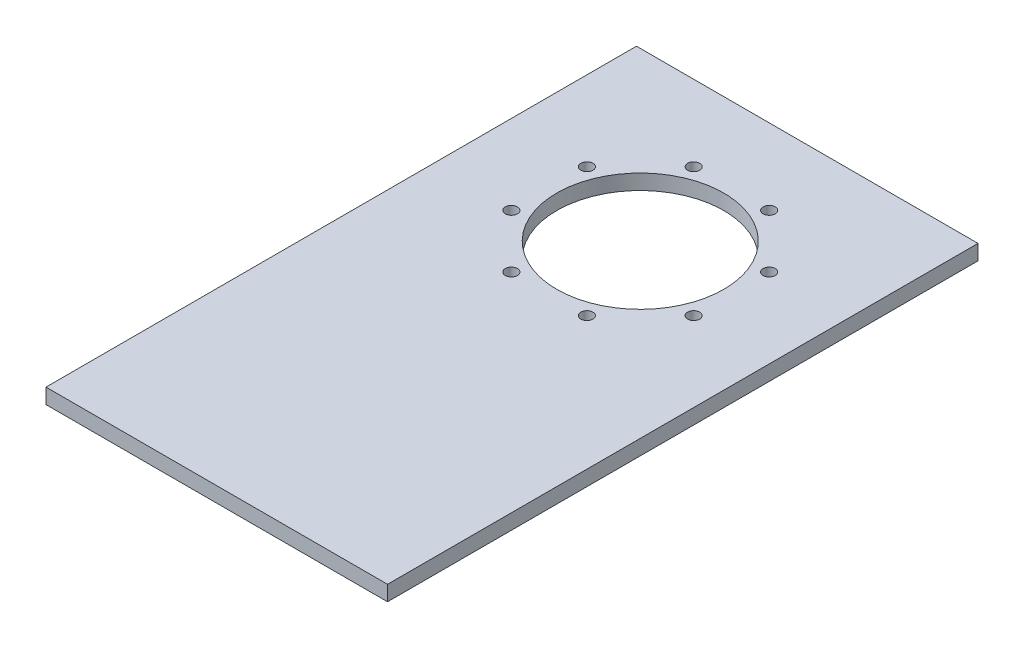
ISO-10303-21;
HEADER;
FILE_DESCRIPTION(('STEP AP214'),'2;1');
FILE_NAME('part.step','',(''),(''),'','','');
FILE_SCHEMA(('AUTOMOTIVE_DESIGN { 1 0 10303 214 1 1 1 1 }'));
ENDSEC;
DATA;
#1=APPLICATION_CONTEXT('core data for automotive mechanical design processes');
#2=APPLICATION_PROTOCOL_DEFINITION('international standard','automotive_design',2000,#1);
#3=PRODUCT_CONTEXT('',#1,'mechanical');
#4=PRODUCT('Part','Part','',(#3));
#5=PRODUCT_RELATED_PRODUCT_CATEGORY('part','',(#4));
#6=PRODUCT_DEFINITION_FORMATION('','',#4);
#7=PRODUCT_DEFINITION_CONTEXT('part definition',#1,'design');
#8=PRODUCT_DEFINITION('design','',#6,#7);
#9=PRODUCT_DEFINITION_SHAPE('','',#8);
#10=(LENGTH_UNIT() NAMED_UNIT(*) SI_UNIT(.MILLI.,.METRE.));
#11=(NAMED_UNIT(*) PLANE_ANGLE_UNIT() SI_UNIT($,.RADIAN.));
#12=(NAMED_UNIT(*) SI_UNIT($,.STERADIAN.) SOLID_ANGLE_UNIT());
#13=UNCERTAINTY_MEASURE_WITH_UNIT(LENGTH_MEASURE(1.E-05),#10,'distance_accuracy_value','');
#14=(GEOMETRIC_REPRESENTATION_CONTEXT(3) GLOBAL_UNCERTAINTY_ASSIGNED_CONTEXT((#13)) GLOBAL_UNIT_ASSIGNED_CONTEXT((#10,
#11,#12)) REPRESENTATION_CONTEXT('',''));
#15=CARTESIAN_POINT('',(0.,0.,0.));
#16=DIRECTION('',(0.,0.,1.));
#17=DIRECTION('',(1.,0.,0.));
#18=AXIS2_PLACEMENT_3D('',#15,#16,#17);
#19=CARTESIAN_POINT('',(0.,10.,0.));
#20=DIRECTION('',(0.,-1.,0.));
#21=DIRECTION('',(0.,0.,-1.));
#22=AXIS2_PLACEMENT_3D('',#19,#20,#21);
#23=PLANE('',#22);
#24=CARTESIAN_POINT('',(-60.0521696132337,10.,24.8744231037308));
#25=DIRECTION('',(0.,1.,0.));
#26=DIRECTION('',(0.,0.,1.));
#27=AXIS2_PLACEMENT_3D('',#24,#25,#26);
#28=CIRCLE('',#27,4.00000000000001);
#29=CARTESIAN_POINT('',(-60.0521696132337,10.,28.8744231037308));
#30=VERTEX_POINT('',#29);
#31=EDGE_CURVE('E120',#30,#30,#28,.T.);
#32=ORIENTED_EDGE('',*,*,#31,.F.);
#33=EDGE_LOOP('',(#32));
#34=FACE_BOUND('',#33,.T.);
#35=CARTESIAN_POINT('',(-60.0521696132336,10.,-24.8744231037309));
#36=DIRECTION('',(0.,1.,0.));
#37=DIRECTION('',(0.,0.,1.));
#38=AXIS2_PLACEMENT_3D('',#35,#36,#37);
#39=CIRCLE('',#38,4.);
#40=CARTESIAN_POINT('',(-60.0521696132336,10.,-20.8744231037309));
#41=VERTEX_POINT('',#40);
#42=EDGE_CURVE('E127',#41,#41,#39,.T.);
#43=ORIENTED_EDGE('',*,*,#42,.F.);
#44=EDGE_LOOP('',(#43));
#45=FACE_BOUND('',#44,.T.);
#46=CARTESIAN_POINT('',(-24.8744231037308,10.,-60.0521696132337));
#47=DIRECTION('',(0.,1.,0.));
#48=DIRECTION('',(0.,0.,1.));
#49=AXIS2_PLACEMENT_3D('',#46,#47,#48);
#50=CIRCLE('',#49,4.00000000000001);
#51=CARTESIAN_POINT('',(-24.8744231037308,10.,-56.0521696132337));
#52=VERTEX_POINT('',#51);
#53=EDGE_CURVE('E133',#52,#52,#50,.T.);
#54=ORIENTED_EDGE('',*,*,#53,.F.);
#55=EDGE_LOOP('',(#54));
#56=FACE_BOUND('',#55,.T.);
#57=CARTESIAN_POINT('',(24.8744231037309,10.,-60.0521696132336));
#58=DIRECTION('',(0.,1.,0.));
#59=DIRECTION('',(0.,0.,1.));
#60=AXIS2_PLACEMENT_3D('',#57,#58,#59);
#61=CIRCLE('',#60,4.);
#62=CARTESIAN_POINT('',(24.8744231037309,10.,-56.0521696132336));
#63=VERTEX_POINT('',#62);
#64=EDGE_CURVE('E139',#63,#63,#61,.T.);
#65=ORIENTED_EDGE('',*,*,#64,.F.);
#66=EDGE_LOOP('',(#65));
#67=FACE_BOUND('',#66,.T.);
#68=CARTESIAN_POINT('',(60.0521696132337,10.,-24.8744231037308));
#69=DIRECTION('',(0.,1.,0.));
#70=DIRECTION('',(0.,0.,1.));
#71=AXIS2_PLACEMENT_3D('',#68,#69,#70);
#72=CIRCLE('',#71,4.00000000000001);
#73=CARTESIAN_POINT('',(60.0521696132337,10.,-20.8744231037308));
#74=VERTEX_POINT('',#73);
#75=EDGE_CURVE('E102',#74,#74,#72,.T.);
#76=ORIENTED_EDGE('',*,*,#75,.F.);
#77=EDGE_LOOP('',(#76));
#78=FACE_BOUND('',#77,.T.);
#79=CARTESIAN_POINT('',(60.0521696132336,10.,24.8744231037309));
#80=DIRECTION('',(0.,1.,0.));
#81=DIRECTION('',(0.,0.,1.));
#82=AXIS2_PLACEMENT_3D('',#79,#80,#81);
#83=CIRCLE('',#82,4.00000000000001);
#84=CARTESIAN_POINT('',(60.0521696132336,10.,28.8744231037309));
#85=VERTEX_POINT('',#84);
#86=EDGE_CURVE('E109',#85,#85,#83,.T.);
#87=ORIENTED_EDGE('',*,*,#86,.F.);
#88=EDGE_LOOP('',(#87));
#89=FACE_BOUND('',#88,.T.);
#90=CARTESIAN_POINT('',(24.8744231037308,10.,60.0521696132337));
#91=DIRECTION('',(0.,1.,0.));
#92=DIRECTION('',(0.,0.,1.));
#93=AXIS2_PLACEMENT_3D('',#90,#91,#92);
#94=CIRCLE('',#93,4.00000000000001);
#95=CARTESIAN_POINT('',(24.8744231037308,10.,64.0521696132337));
#96=VERTEX_POINT('',#95);
#97=EDGE_CURVE('E115',#96,#96,#94,.T.);
#98=ORIENTED_EDGE('',*,*,#97,.F.);
#99=EDGE_LOOP('',(#98));
#100=FACE_BOUND('',#99,.T.);
#101=CARTESIAN_POINT('',(-24.8744231037309,10.,60.0521696132336));
#102=DIRECTION('',(0.,1.,0.));
#103=DIRECTION('',(0.,0.,1.));
#104=AXIS2_PLACEMENT_3D('',#101,#102,#103);
#105=CIRCLE('',#104,4.);
#106=CARTESIAN_POINT('',(-24.8744231037309,10.,64.0521696132336));
#107=VERTEX_POINT('',#106);
#108=EDGE_CURVE('E144',#107,#107,#105,.T.);
#109=ORIENTED_EDGE('',*,*,#108,.F.);
#110=EDGE_LOOP('',(#109));
#111=FACE_BOUND('',#110,.T.);
#112=DIRECTION('',(0.,0.,-1.));
#113=VECTOR('',#112,1.);
#114=CARTESIAN_POINT('',(112.5,10.,110.));
#115=LINE('',#114,#113);
#116=CARTESIAN_POINT('',(112.5,10.,279.));
#117=VERTEX_POINT('',#116);
#118=CARTESIAN_POINT('',(112.5,10.,-110.));
#119=VERTEX_POINT('',#118);
#120=EDGE_CURVE('E82',#117,#119,#115,.T.);
#121=ORIENTED_EDGE('',*,*,#120,.T.);
#122=DIRECTION('',(-1.,0.,0.));
#123=VECTOR('',#122,1.);
#124=CARTESIAN_POINT('',(-112.5,10.,-110.));
#125=LINE('',#124,#123);
#126=CARTESIAN_POINT('',(-112.5,10.,-110.));
#127=VERTEX_POINT('',#126);
#128=EDGE_CURVE('E50',#119,#127,#125,.T.);
#129=ORIENTED_EDGE('',*,*,#128,.T.);
#130=DIRECTION('',(0.,0.,1.));
#131=VECTOR('',#130,1.);
#132=CARTESIAN_POINT('',(-112.5,10.,110.));
#133=LINE('',#132,#131);
#134=CARTESIAN_POINT('',(-112.5,10.,279.));
#135=VERTEX_POINT('',#134);
#136=EDGE_CURVE('E65',#127,#135,#133,.T.);
#137=ORIENTED_EDGE('',*,*,#136,.T.);
#138=DIRECTION('',(-1.,0.,0.));
#139=VECTOR('',#138,1.);
#140=CARTESIAN_POINT('',(-112.5,10.,279.));
#141=LINE('',#140,#139);
#142=EDGE_CURVE('E96',#117,#135,#141,.T.);
#143=ORIENTED_EDGE('',*,*,#142,.F.);
#144=EDGE_LOOP('',(#121,#129,#137,#143));
#145=FACE_BOUND('',#144,.T.);
#146=CARTESIAN_POINT('',(0.,10.,0.));
#147=DIRECTION('',(0.,1.,0.));
#148=DIRECTION('',(0.,0.,1.));
#149=AXIS2_PLACEMENT_3D('',#146,#147,#148);
#150=CIRCLE('',#149,55.);
#151=CARTESIAN_POINT('',(0.,10.,55.));
#152=VERTEX_POINT('',#151);
#153=EDGE_CURVE('E150',#152,#152,#150,.T.);
#154=ORIENTED_EDGE('',*,*,#153,.F.);
#155=EDGE_LOOP('',(#154));
#156=FACE_BOUND('',#155,.T.);
#157=ADVANCED_FACE('F33',(#34,#45,#56,#67,#78,#89,#100,#111,#145,#156),#23,.F.);
#158=CARTESIAN_POINT('',(0.,0.,0.));
#159=DIRECTION('',(0.,-1.,0.));
#160=DIRECTION('',(0.,0.,-1.));
#161=AXIS2_PLACEMENT_3D('',#158,#159,#160);
#162=PLANE('',#161);
#163=CARTESIAN_POINT('',(-60.0521696132337,0.,24.8744231037308));
#164=DIRECTION('',(0.,1.,0.));
#165=DIRECTION('',(0.,0.,1.));
#166=AXIS2_PLACEMENT_3D('',#163,#164,#165);
#167=CIRCLE('',#166,4.00000000000001);
#168=CARTESIAN_POINT('',(-60.0521696132337,0.,28.8744231037308));
#169=VERTEX_POINT('',#168);
#170=EDGE_CURVE('E124',#169,#169,#167,.T.);
#171=ORIENTED_EDGE('',*,*,#170,.T.);
#172=EDGE_LOOP('',(#171));
#173=FACE_BOUND('',#172,.T.);
#174=CARTESIAN_POINT('',(-60.0521696132336,0.,-24.8744231037309));
#175=DIRECTION('',(0.,1.,0.));
#176=DIRECTION('',(0.,0.,1.));
#177=AXIS2_PLACEMENT_3D('',#174,#175,#176);
#178=CIRCLE('',#177,4.);
#179=CARTESIAN_POINT('',(-60.0521696132336,0.,-20.8744231037309));
#180=VERTEX_POINT('',#179);
#181=EDGE_CURVE('E130',#180,#180,#178,.T.);
#182=ORIENTED_EDGE('',*,*,#181,.T.);
#183=EDGE_LOOP('',(#182));
#184=FACE_BOUND('',#183,.T.);
#185=CARTESIAN_POINT('',(-24.8744231037308,0.,-60.0521696132337));
#186=DIRECTION('',(0.,1.,0.));
#187=DIRECTION('',(0.,0.,1.));
#188=AXIS2_PLACEMENT_3D('',#185,#186,#187);
#189=CIRCLE('',#188,4.00000000000001);
#190=CARTESIAN_POINT('',(-24.8744231037308,0.,-56.0521696132337));
#191=VERTEX_POINT('',#190);
#192=EDGE_CURVE('E136',#191,#191,#189,.T.);
#193=ORIENTED_EDGE('',*,*,#192,.T.);
#194=EDGE_LOOP('',(#193));
#195=FACE_BOUND('',#194,.T.);
#196=CARTESIAN_POINT('',(24.8744231037309,0.,-60.0521696132336));
#197=DIRECTION('',(0.,1.,0.));
#198=DIRECTION('',(0.,0.,1.));
#199=AXIS2_PLACEMENT_3D('',#196,#197,#198);
#200=CIRCLE('',#199,4.);
#201=CARTESIAN_POINT('',(24.8744231037309,0.,-56.0521696132336));
#202=VERTEX_POINT('',#201);
#203=EDGE_CURVE('E105',#202,#202,#200,.T.);
#204=ORIENTED_EDGE('',*,*,#203,.T.);
#205=EDGE_LOOP('',(#204));
#206=FACE_BOUND('',#205,.T.);
#207=CARTESIAN_POINT('',(60.0521696132337,0.,-24.8744231037308));
#208=DIRECTION('',(0.,1.,0.));
#209=DIRECTION('',(0.,0.,1.));
#210=AXIS2_PLACEMENT_3D('',#207,#208,#209);
#211=CIRCLE('',#210,4.00000000000001);
#212=CARTESIAN_POINT('',(60.0521696132337,0.,-20.8744231037308));
#213=VERTEX_POINT('',#212);
#214=EDGE_CURVE('E106',#213,#213,#211,.T.);
#215=ORIENTED_EDGE('',*,*,#214,.T.);
#216=EDGE_LOOP('',(#215));
#217=FACE_BOUND('',#216,.T.);
#218=CARTESIAN_POINT('',(60.0521696132336,0.,24.8744231037309));
#219=DIRECTION('',(0.,1.,0.));
#220=DIRECTION('',(0.,0.,1.));
#221=AXIS2_PLACEMENT_3D('',#218,#219,#220);
#222=CIRCLE('',#221,4.00000000000001);
#223=CARTESIAN_POINT('',(60.0521696132336,0.,28.8744231037309));
#224=VERTEX_POINT('',#223);
#225=EDGE_CURVE('E112',#224,#224,#222,.T.);
#226=ORIENTED_EDGE('',*,*,#225,.T.);
#227=EDGE_LOOP('',(#226));
#228=FACE_BOUND('',#227,.T.);
#229=CARTESIAN_POINT('',(24.8744231037308,0.,60.0521696132337));
#230=DIRECTION('',(0.,1.,0.));
#231=DIRECTION('',(0.,0.,1.));
#232=AXIS2_PLACEMENT_3D('',#229,#230,#231);
#233=CIRCLE('',#232,4.00000000000001);
#234=CARTESIAN_POINT('',(24.8744231037308,0.,64.0521696132337));
#235=VERTEX_POINT('',#234);
#236=EDGE_CURVE('E101',#235,#235,#233,.T.);
#237=ORIENTED_EDGE('',*,*,#236,.T.);
#238=EDGE_LOOP('',(#237));
#239=FACE_BOUND('',#238,.T.);
#240=CARTESIAN_POINT('',(-24.8744231037309,0.,60.0521696132336));
#241=DIRECTION('',(0.,1.,0.));
#242=DIRECTION('',(0.,0.,1.));
#243=AXIS2_PLACEMENT_3D('',#240,#241,#242);
#244=CIRCLE('',#243,4.);
#245=CARTESIAN_POINT('',(-24.8744231037309,0.,64.0521696132336));
#246=VERTEX_POINT('',#245);
#247=EDGE_CURVE('E123',#246,#246,#244,.T.);
#248=ORIENTED_EDGE('',*,*,#247,.T.);
#249=EDGE_LOOP('',(#248));
#250=FACE_BOUND('',#249,.T.);
#251=DIRECTION('',(0.,0.,-1.));
#252=VECTOR('',#251,1.);
#253=CARTESIAN_POINT('',(112.5,0.,110.));
#254=LINE('',#253,#252);
#255=CARTESIAN_POINT('',(112.5,0.,279.));
#256=VERTEX_POINT('',#255);
#257=CARTESIAN_POINT('',(112.5,0.,-110.));
#258=VERTEX_POINT('',#257);
#259=EDGE_CURVE('E89',#256,#258,#254,.T.);
#260=ORIENTED_EDGE('',*,*,#259,.F.);
#261=DIRECTION('',(1.,0.,0.));
#262=VECTOR('',#261,1.);
#263=CARTESIAN_POINT('',(-112.5,0.,279.));
#264=LINE('',#263,#262);
#265=CARTESIAN_POINT('',(-112.5,0.,279.));
#266=VERTEX_POINT('',#265);
#267=EDGE_CURVE('E85',#266,#256,#264,.T.);
#268=ORIENTED_EDGE('',*,*,#267,.F.);
#269=DIRECTION('',(0.,0.,1.));
#270=VECTOR('',#269,1.);
#271=CARTESIAN_POINT('',(-112.5,0.,110.));
#272=LINE('',#271,#270);
#273=CARTESIAN_POINT('',(-112.5,0.,-110.));
#274=VERTEX_POINT('',#273);
#275=EDGE_CURVE('E77',#274,#266,#272,.T.);
#276=ORIENTED_EDGE('',*,*,#275,.F.);
#277=DIRECTION('',(-1.,0.,0.));
#278=VECTOR('',#277,1.);
#279=CARTESIAN_POINT('',(-112.5,0.,-110.));
#280=LINE('',#279,#278);
#281=EDGE_CURVE('E61',#258,#274,#280,.T.);
#282=ORIENTED_EDGE('',*,*,#281,.F.);
#283=EDGE_LOOP('',(#260,#268,#276,#282));
#284=FACE_BOUND('',#283,.T.);
#285=CARTESIAN_POINT('',(0.,0.,0.));
#286=DIRECTION('',(0.,1.,0.));
#287=DIRECTION('',(0.,0.,1.));
#288=AXIS2_PLACEMENT_3D('',#285,#286,#287);
#289=CIRCLE('',#288,55.);
#290=CARTESIAN_POINT('',(0.,0.,55.));
#291=VERTEX_POINT('',#290);
#292=EDGE_CURVE('E147',#291,#291,#289,.T.);
#293=ORIENTED_EDGE('',*,*,#292,.T.);
#294=EDGE_LOOP('',(#293));
#295=FACE_BOUND('',#294,.T.);
#296=ADVANCED_FACE('F86',(#173,#184,#195,#206,#217,#228,#239,#250,#284,#295),#162,.T.);
#297=CARTESIAN_POINT('',(112.5,10.,110.));
#298=DIRECTION('',(-1.,0.,0.));
#299=DIRECTION('',(0.,0.,1.));
#300=AXIS2_PLACEMENT_3D('',#297,#298,#299);
#301=PLANE('',#300);
#302=ORIENTED_EDGE('',*,*,#259,.T.);
#303=DIRECTION('',(0.,-1.,0.));
#304=VECTOR('',#303,1.);
#305=CARTESIAN_POINT('',(112.5,10.,-110.));
#306=LINE('',#305,#304);
#307=EDGE_CURVE('E11',#119,#258,#306,.T.);
#308=ORIENTED_EDGE('',*,*,#307,.F.);
#309=ORIENTED_EDGE('',*,*,#120,.F.);
#310=DIRECTION('',(0.,1.,0.));
#311=VECTOR('',#310,1.);
#312=CARTESIAN_POINT('',(112.5,10.,279.));
#313=LINE('',#312,#311);
#314=EDGE_CURVE('E93',#256,#117,#313,.T.);
#315=ORIENTED_EDGE('',*,*,#314,.F.);
#316=EDGE_LOOP('',(#302,#308,#309,#315));
#317=FACE_BOUND('',#316,.T.);
#318=ADVANCED_FACE('F35',(#317),#301,.F.);
#319=CARTESIAN_POINT('',(-112.5,10.,-110.));
#320=DIRECTION('',(0.,0.,1.));
#321=DIRECTION('',(1.,0.,0.));
#322=AXIS2_PLACEMENT_3D('',#319,#320,#321);
#323=PLANE('',#322);
#324=ORIENTED_EDGE('',*,*,#281,.T.);
#325=DIRECTION('',(0.,-1.,0.));
#326=VECTOR('',#325,1.);
#327=CARTESIAN_POINT('',(-112.5,10.,-110.));
#328=LINE('',#327,#326);
#329=EDGE_CURVE('E42',#127,#274,#328,.T.);
#330=ORIENTED_EDGE('',*,*,#329,.F.);
#331=ORIENTED_EDGE('',*,*,#128,.F.);
#332=ORIENTED_EDGE('',*,*,#307,.T.);
#333=EDGE_LOOP('',(#324,#330,#331,#332));
#334=FACE_BOUND('',#333,.T.);
#335=ADVANCED_FACE('F160',(#334),#323,.F.);
#336=CARTESIAN_POINT('',(-112.5,10.,110.));
#337=DIRECTION('',(1.,0.,0.));
#338=DIRECTION('',(0.,0.,-1.));
#339=AXIS2_PLACEMENT_3D('',#336,#337,#338);
#340=PLANE('',#339);
#341=ORIENTED_EDGE('',*,*,#275,.T.);
#342=DIRECTION('',(0.,-1.,0.));
#343=VECTOR('',#342,1.);
#344=CARTESIAN_POINT('',(-112.5,10.,279.));
#345=LINE('',#344,#343);
#346=EDGE_CURVE('E81',#135,#266,#345,.T.);
#347=ORIENTED_EDGE('',*,*,#346,.F.);
#348=ORIENTED_EDGE('',*,*,#136,.F.);
#349=ORIENTED_EDGE('',*,*,#329,.T.);
#350=EDGE_LOOP('',(#341,#347,#348,#349));
#351=FACE_BOUND('',#350,.T.);
#352=ADVANCED_FACE('F79',(#351),#340,.F.);
#353=CARTESIAN_POINT('',(0.,10.,0.));
#354=DIRECTION('',(0.,-1.,0.));
#355=DIRECTION('',(0.,0.,-1.));
#356=AXIS2_PLACEMENT_3D('',#353,#354,#355);
#357=CYLINDRICAL_SURFACE('',#356,55.);
#358=ORIENTED_EDGE('',*,*,#153,.T.);
#359=EDGE_LOOP('',(#358));
#360=FACE_BOUND('',#359,.T.);
#361=ORIENTED_EDGE('',*,*,#292,.F.);
#362=EDGE_LOOP('',(#361));
#363=FACE_BOUND('',#362,.T.);
#364=ADVANCED_FACE('F169',(#360,#363),#357,.F.);
#365=CARTESIAN_POINT('',(-24.8744231037309,10.,60.0521696132336));
#366=DIRECTION('',(0.,-1.,0.));
#367=DIRECTION('',(0.,0.,-1.));
#368=AXIS2_PLACEMENT_3D('',#365,#366,#367);
#369=CYLINDRICAL_SURFACE('',#368,4.);
#370=ORIENTED_EDGE('',*,*,#108,.T.);
#371=EDGE_LOOP('',(#370));
#372=FACE_BOUND('',#371,.T.);
#373=ORIENTED_EDGE('',*,*,#247,.F.);
#374=EDGE_LOOP('',(#373));
#375=FACE_BOUND('',#374,.T.);
#376=ADVANCED_FACE('F172',(#372,#375),#369,.F.);
#377=CARTESIAN_POINT('',(24.8744231037308,10.,60.0521696132337));
#378=DIRECTION('',(0.,-1.,0.));
#379=DIRECTION('',(0.,0.,-1.));
#380=AXIS2_PLACEMENT_3D('',#377,#378,#379);
#381=CYLINDRICAL_SURFACE('',#380,4.00000000000001);
#382=ORIENTED_EDGE('',*,*,#97,.T.);
#383=EDGE_LOOP('',(#382));
#384=FACE_BOUND('',#383,.T.);
#385=ORIENTED_EDGE('',*,*,#236,.F.);
#386=EDGE_LOOP('',(#385));
#387=FACE_BOUND('',#386,.T.);
#388=ADVANCED_FACE('F204',(#384,#387),#381,.F.);
#389=CARTESIAN_POINT('',(60.0521696132336,10.,24.8744231037309));
#390=DIRECTION('',(0.,-1.,0.));
#391=DIRECTION('',(0.,0.,-1.));
#392=AXIS2_PLACEMENT_3D('',#389,#390,#391);
#393=CYLINDRICAL_SURFACE('',#392,4.00000000000001);
#394=ORIENTED_EDGE('',*,*,#86,.T.);
#395=EDGE_LOOP('',(#394));
#396=FACE_BOUND('',#395,.T.);
#397=ORIENTED_EDGE('',*,*,#225,.F.);
#398=EDGE_LOOP('',(#397));
#399=FACE_BOUND('',#398,.T.);
#400=ADVANCED_FACE('F212',(#396,#399),#393,.F.);
#401=CARTESIAN_POINT('',(60.0521696132337,10.,-24.8744231037308));
#402=DIRECTION('',(0.,-1.,0.));
#403=DIRECTION('',(0.,0.,-1.));
#404=AXIS2_PLACEMENT_3D('',#401,#402,#403);
#405=CYLINDRICAL_SURFACE('',#404,4.00000000000001);
#406=ORIENTED_EDGE('',*,*,#75,.T.);
#407=EDGE_LOOP('',(#406));
#408=FACE_BOUND('',#407,.T.);
#409=ORIENTED_EDGE('',*,*,#214,.F.);
#410=EDGE_LOOP('',(#409));
#411=FACE_BOUND('',#410,.T.);
#412=ADVANCED_FACE('F220',(#408,#411),#405,.F.);
#413=CARTESIAN_POINT('',(24.8744231037309,10.,-60.0521696132336));
#414=DIRECTION('',(0.,-1.,0.));
#415=DIRECTION('',(0.,0.,-1.));
#416=AXIS2_PLACEMENT_3D('',#413,#414,#415);
#417=CYLINDRICAL_SURFACE('',#416,4.);
#418=ORIENTED_EDGE('',*,*,#64,.T.);
#419=EDGE_LOOP('',(#418));
#420=FACE_BOUND('',#419,.T.);
#421=ORIENTED_EDGE('',*,*,#203,.F.);
#422=EDGE_LOOP('',(#421));
#423=FACE_BOUND('',#422,.T.);
#424=ADVANCED_FACE('F228',(#420,#423),#417,.F.);
#425=CARTESIAN_POINT('',(-24.8744231037308,10.,-60.0521696132337));
#426=DIRECTION('',(0.,-1.,0.));
#427=DIRECTION('',(0.,0.,-1.));
#428=AXIS2_PLACEMENT_3D('',#425,#426,#427);
#429=CYLINDRICAL_SURFACE('',#428,4.00000000000001);
#430=ORIENTED_EDGE('',*,*,#53,.T.);
#431=EDGE_LOOP('',(#430));
#432=FACE_BOUND('',#431,.T.);
#433=ORIENTED_EDGE('',*,*,#192,.F.);
#434=EDGE_LOOP('',(#433));
#435=FACE_BOUND('',#434,.T.);
#436=ADVANCED_FACE('F236',(#432,#435),#429,.F.);
#437=CARTESIAN_POINT('',(-60.0521696132336,10.,-24.8744231037309));
#438=DIRECTION('',(0.,-1.,0.));
#439=DIRECTION('',(0.,0.,-1.));
#440=AXIS2_PLACEMENT_3D('',#437,#438,#439);
#441=CYLINDRICAL_SURFACE('',#440,4.);
#442=ORIENTED_EDGE('',*,*,#42,.T.);
#443=EDGE_LOOP('',(#442));
#444=FACE_BOUND('',#443,.T.);
#445=ORIENTED_EDGE('',*,*,#181,.F.);
#446=EDGE_LOOP('',(#445));
#447=FACE_BOUND('',#446,.T.);
#448=ADVANCED_FACE('F244',(#444,#447),#441,.F.);
#449=CARTESIAN_POINT('',(-60.0521696132337,10.,24.8744231037308));
#450=DIRECTION('',(0.,-1.,0.));
#451=DIRECTION('',(0.,0.,-1.));
#452=AXIS2_PLACEMENT_3D('',#449,#450,#451);
#453=CYLINDRICAL_SURFACE('',#452,4.00000000000001);
#454=ORIENTED_EDGE('',*,*,#31,.T.);
#455=EDGE_LOOP('',(#454));
#456=FACE_BOUND('',#455,.T.);
#457=ORIENTED_EDGE('',*,*,#170,.F.);
#458=EDGE_LOOP('',(#457));
#459=FACE_BOUND('',#458,.T.);
#460=ADVANCED_FACE('F252',(#456,#459),#453,.F.);
#461=CARTESIAN_POINT('',(0.,0.,279.));
#462=DIRECTION('',(0.,0.,1.));
#463=DIRECTION('',(1.,0.,0.));
#464=AXIS2_PLACEMENT_3D('',#461,#462,#463);
#465=PLANE('',#464);
#466=ORIENTED_EDGE('',*,*,#346,.T.);
#467=ORIENTED_EDGE('',*,*,#267,.T.);
#468=ORIENTED_EDGE('',*,*,#314,.T.);
#469=ORIENTED_EDGE('',*,*,#142,.T.);
#470=EDGE_LOOP('',(#466,#467,#468,#469));
#471=FACE_BOUND('',#470,.T.);
#472=ADVANCED_FACE('F95',(#471),#465,.T.);
#473=CLOSED_SHELL('',(#157,#296,#318,#335,#352,#364,#376,#388,#400,#412,#424,#436,#448,#460,#472));
#474=MANIFOLD_SOLID_BREP('B2',#473);
#475=ADVANCED_BREP_SHAPE_REPRESENTATION('',(#18,#474),#14);
#476=SHAPE_DEFINITION_REPRESENTATION(#9,#475);
ENDSEC;
END-ISO-10303-21;
